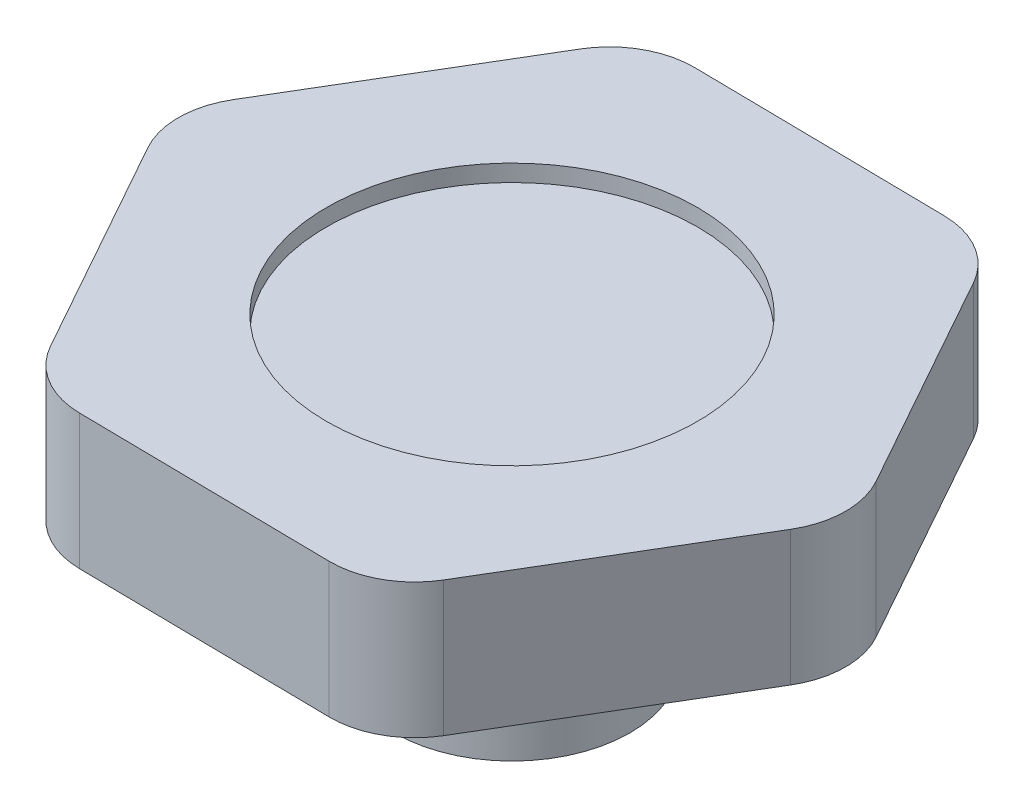
ISO-10303-21;
HEADER;
FILE_DESCRIPTION(('STEP AP214'),'2;1');
FILE_NAME('part.step','',(''),(''),'','','');
FILE_SCHEMA(('AUTOMOTIVE_DESIGN { 1 0 10303 214 1 1 1 1 }'));
ENDSEC;
DATA;
#1=APPLICATION_CONTEXT('core data for automotive mechanical design processes');
#2=APPLICATION_PROTOCOL_DEFINITION('international standard','automotive_design',2000,#1);
#3=PRODUCT_CONTEXT('',#1,'mechanical');
#4=PRODUCT('Part','Part','',(#3));
#5=PRODUCT_RELATED_PRODUCT_CATEGORY('part','',(#4));
#6=PRODUCT_DEFINITION_FORMATION('','',#4);
#7=PRODUCT_DEFINITION_CONTEXT('part definition',#1,'design');
#8=PRODUCT_DEFINITION('design','',#6,#7);
#9=PRODUCT_DEFINITION_SHAPE('','',#8);
#10=(LENGTH_UNIT() NAMED_UNIT(*) SI_UNIT(.MILLI.,.METRE.));
#11=(NAMED_UNIT(*) PLANE_ANGLE_UNIT() SI_UNIT($,.RADIAN.));
#12=(NAMED_UNIT(*) SI_UNIT($,.STERADIAN.) SOLID_ANGLE_UNIT());
#13=UNCERTAINTY_MEASURE_WITH_UNIT(LENGTH_MEASURE(1.E-05),#10,'distance_accuracy_value','');
#14=(GEOMETRIC_REPRESENTATION_CONTEXT(3) GLOBAL_UNCERTAINTY_ASSIGNED_CONTEXT((#13)) GLOBAL_UNIT_ASSIGNED_CONTEXT((#10,
#11,#12)) REPRESENTATION_CONTEXT('',''));
#15=CARTESIAN_POINT('',(0.,0.,0.));
#16=DIRECTION('',(0.,0.,1.));
#17=DIRECTION('',(1.,0.,0.));
#18=AXIS2_PLACEMENT_3D('',#15,#16,#17);
#19=CARTESIAN_POINT('',(0.,10.,0.));
#20=DIRECTION('',(0.,-1.,0.));
#21=DIRECTION('',(0.,0.,-1.));
#22=AXIS2_PLACEMENT_3D('',#19,#20,#21);
#23=CYLINDRICAL_SURFACE('',#22,7.);
#24=CARTESIAN_POINT('',(0.,10.,0.));
#25=DIRECTION('',(0.,1.,0.));
#26=DIRECTION('',(0.,0.,1.));
#27=AXIS2_PLACEMENT_3D('',#24,#25,#26);
#28=CIRCLE('',#27,7.);
#29=CARTESIAN_POINT('',(0.,10.,7.));
#30=VERTEX_POINT('',#29);
#31=EDGE_CURVE('E227',#30,#30,#28,.T.);
#32=ORIENTED_EDGE('',*,*,#31,.F.);
#33=EDGE_LOOP('',(#32));
#34=FACE_BOUND('',#33,.T.);
#35=CARTESIAN_POINT('',(0.,0.,0.));
#36=DIRECTION('',(0.,1.,0.));
#37=DIRECTION('',(0.,0.,1.));
#38=AXIS2_PLACEMENT_3D('',#35,#36,#37);
#39=CIRCLE('',#38,7.);
#40=CARTESIAN_POINT('',(0.,0.,7.));
#41=VERTEX_POINT('',#40);
#42=EDGE_CURVE('E219',#41,#41,#39,.T.);
#43=ORIENTED_EDGE('',*,*,#42,.T.);
#44=EDGE_LOOP('',(#43));
#45=FACE_BOUND('',#44,.T.);
#46=ADVANCED_FACE('F39',(#34,#45),#23,.T.);
#47=CARTESIAN_POINT('',(0.,0.,0.));
#48=DIRECTION('',(0.,1.,0.));
#49=DIRECTION('',(0.,0.,1.));
#50=AXIS2_PLACEMENT_3D('',#47,#48,#49);
#51=PLANE('',#50);
#52=DIRECTION('',(-0.00508635289667691,0.,0.999987064423441));
#53=VECTOR('',#52,1.);
#54=CARTESIAN_POINT('',(4.76388744027827,0.,-2.71821812768812));
#55=LINE('',#54,#53);
#56=CARTESIAN_POINT('',(4.76388744027827,0.,-2.71821812768812));
#57=VERTEX_POINT('',#56);
#58=CARTESIAN_POINT('',(4.73598967174442,0.,2.76653848020655));
#59=VERTEX_POINT('',#58);
#60=EDGE_CURVE('E210',#57,#59,#55,.T.);
#61=ORIENTED_EDGE('',*,*,#60,.F.);
#62=DIRECTION('',(0.863471024798187,0.,0.504398443032855));
#63=VECTOR('',#62,1.);
#64=CARTESIAN_POINT('',(0.0278977685338532,0.,-5.48475660789466));
#65=LINE('',#64,#63);
#66=CARTESIAN_POINT('',(0.0278977685338532,0.,-5.48475660789466));
#67=VERTEX_POINT('',#66);
#68=EDGE_CURVE('E175',#67,#57,#65,.T.);
#69=ORIENTED_EDGE('',*,*,#68,.F.);
#70=DIRECTION('',(0.868557377694864,0.,-0.495588621390586));
#71=VECTOR('',#70,1.);
#72=CARTESIAN_POINT('',(-4.73598967174442,0.,-2.76653848020655));
#73=LINE('',#72,#71);
#74=CARTESIAN_POINT('',(-4.73598967174442,0.,-2.76653848020655));
#75=VERTEX_POINT('',#74);
#76=EDGE_CURVE('E189',#75,#67,#73,.T.);
#77=ORIENTED_EDGE('',*,*,#76,.F.);
#78=DIRECTION('',(0.00508635289667691,0.,-0.999987064423441));
#79=VECTOR('',#78,1.);
#80=CARTESIAN_POINT('',(-4.76388744027827,0.,2.71821812768812));
#81=LINE('',#80,#79);
#82=CARTESIAN_POINT('',(-4.76388744027827,0.,2.71821812768812));
#83=VERTEX_POINT('',#82);
#84=EDGE_CURVE('E194',#83,#75,#81,.T.);
#85=ORIENTED_EDGE('',*,*,#84,.F.);
#86=DIRECTION('',(-0.863471024798187,0.,-0.504398443032855));
#87=VECTOR('',#86,1.);
#88=CARTESIAN_POINT('',(-0.0278977685338532,0.,5.48475660789466));
#89=LINE('',#88,#87);
#90=CARTESIAN_POINT('',(-0.0278977685338532,0.,5.48475660789466));
#91=VERTEX_POINT('',#90);
#92=EDGE_CURVE('E213',#91,#83,#89,.T.);
#93=ORIENTED_EDGE('',*,*,#92,.F.);
#94=DIRECTION('',(-0.868557377694864,0.,0.495588621390586));
#95=VECTOR('',#94,1.);
#96=CARTESIAN_POINT('',(4.73598967174442,0.,2.76653848020655));
#97=LINE('',#96,#95);
#98=EDGE_CURVE('E209',#59,#91,#97,.T.);
#99=ORIENTED_EDGE('',*,*,#98,.F.);
#100=EDGE_LOOP('',(#61,#69,#77,#85,#93,#99));
#101=FACE_BOUND('',#100,.T.);
#102=ORIENTED_EDGE('',*,*,#42,.F.);
#103=EDGE_LOOP('',(#102));
#104=FACE_BOUND('',#103,.T.);
#105=ADVANCED_FACE('F355',(#101,#104),#51,.F.);
#106=CARTESIAN_POINT('',(0.0278977685338532,5.,-5.48475660789466));
#107=DIRECTION('',(0.504398443032855,0.,-0.863471024798187));
#108=DIRECTION('',(-0.863471024798187,0.,-0.504398443032855));
#109=AXIS2_PLACEMENT_3D('',#106,#107,#108);
#110=PLANE('',#109);
#111=ORIENTED_EDGE('',*,*,#68,.T.);
#112=DIRECTION('',(0.,-1.,0.));
#113=VECTOR('',#112,1.);
#114=CARTESIAN_POINT('',(4.76388744027827,5.,-2.71821812768812));
#115=LINE('',#114,#113);
#116=CARTESIAN_POINT('',(4.76388744027827,5.,-2.71821812768812));
#117=VERTEX_POINT('',#116);
#118=EDGE_CURVE('E164',#117,#57,#115,.T.);
#119=ORIENTED_EDGE('',*,*,#118,.F.);
#120=DIRECTION('',(0.863471024798187,0.,0.504398443032855));
#121=VECTOR('',#120,1.);
#122=CARTESIAN_POINT('',(0.0278977685338532,5.,-5.48475660789466));
#123=LINE('',#122,#121);
#124=CARTESIAN_POINT('',(0.0278977685338532,5.,-5.48475660789466));
#125=VERTEX_POINT('',#124);
#126=EDGE_CURVE('E166',#125,#117,#123,.T.);
#127=ORIENTED_EDGE('',*,*,#126,.F.);
#128=DIRECTION('',(0.,-1.,0.));
#129=VECTOR('',#128,1.);
#130=CARTESIAN_POINT('',(0.0278977685338532,5.,-5.48475660789466));
#131=LINE('',#130,#129);
#132=EDGE_CURVE('E217',#125,#67,#131,.T.);
#133=ORIENTED_EDGE('',*,*,#132,.T.);
#134=EDGE_LOOP('',(#111,#119,#127,#133));
#135=FACE_BOUND('',#134,.T.);
#136=ADVANCED_FACE('F170',(#135),#110,.F.);
#137=CARTESIAN_POINT('',(-4.73598967174442,5.,-2.76653848020655));
#138=DIRECTION('',(-0.495588621390586,0.,-0.868557377694864));
#139=DIRECTION('',(-0.868557377694864,0.,0.495588621390586));
#140=AXIS2_PLACEMENT_3D('',#137,#138,#139);
#141=PLANE('',#140);
#142=ORIENTED_EDGE('',*,*,#76,.T.);
#143=ORIENTED_EDGE('',*,*,#132,.F.);
#144=DIRECTION('',(0.868557377694864,0.,-0.495588621390586));
#145=VECTOR('',#144,1.);
#146=CARTESIAN_POINT('',(-4.73598967174442,5.,-2.76653848020655));
#147=LINE('',#146,#145);
#148=CARTESIAN_POINT('',(-4.73598967174442,5.,-2.76653848020655));
#149=VERTEX_POINT('',#148);
#150=EDGE_CURVE('E177',#149,#125,#147,.T.);
#151=ORIENTED_EDGE('',*,*,#150,.F.);
#152=DIRECTION('',(0.,-1.,0.));
#153=VECTOR('',#152,1.);
#154=CARTESIAN_POINT('',(-4.73598967174442,5.,-2.76653848020655));
#155=LINE('',#154,#153);
#156=EDGE_CURVE('E222',#149,#75,#155,.T.);
#157=ORIENTED_EDGE('',*,*,#156,.T.);
#158=EDGE_LOOP('',(#142,#143,#151,#157));
#159=FACE_BOUND('',#158,.T.);
#160=ADVANCED_FACE('F415',(#159),#141,.F.);
#161=CARTESIAN_POINT('',(-4.76388744027827,5.,2.71821812768812));
#162=DIRECTION('',(-0.999987064423441,0.,-0.00508635289667691));
#163=DIRECTION('',(-0.00508635289667691,0.,0.999987064423441));
#164=AXIS2_PLACEMENT_3D('',#161,#162,#163);
#165=PLANE('',#164);
#166=ORIENTED_EDGE('',*,*,#84,.T.);
#167=ORIENTED_EDGE('',*,*,#156,.F.);
#168=DIRECTION('',(0.00508635289667691,0.,-0.999987064423441));
#169=VECTOR('',#168,1.);
#170=CARTESIAN_POINT('',(-4.76388744027827,5.,2.71821812768812));
#171=LINE('',#170,#169);
#172=CARTESIAN_POINT('',(-4.76388744027827,5.,2.71821812768812));
#173=VERTEX_POINT('',#172);
#174=EDGE_CURVE('E201',#173,#149,#171,.T.);
#175=ORIENTED_EDGE('',*,*,#174,.F.);
#176=DIRECTION('',(0.,-1.,0.));
#177=VECTOR('',#176,1.);
#178=CARTESIAN_POINT('',(-4.76388744027827,5.,2.71821812768812));
#179=LINE('',#178,#177);
#180=EDGE_CURVE('E224',#173,#83,#179,.T.);
#181=ORIENTED_EDGE('',*,*,#180,.T.);
#182=EDGE_LOOP('',(#166,#167,#175,#181));
#183=FACE_BOUND('',#182,.T.);
#184=ADVANCED_FACE('F416',(#183),#165,.F.);
#185=CARTESIAN_POINT('',(-0.0278977685338532,5.,5.48475660789466));
#186=DIRECTION('',(-0.504398443032855,0.,0.863471024798187));
#187=DIRECTION('',(0.863471024798187,0.,0.504398443032855));
#188=AXIS2_PLACEMENT_3D('',#185,#186,#187);
#189=PLANE('',#188);
#190=ORIENTED_EDGE('',*,*,#92,.T.);
#191=ORIENTED_EDGE('',*,*,#180,.F.);
#192=DIRECTION('',(-0.863471024798187,0.,-0.504398443032855));
#193=VECTOR('',#192,1.);
#194=CARTESIAN_POINT('',(-0.0278977685338532,5.,5.48475660789466));
#195=LINE('',#194,#193);
#196=CARTESIAN_POINT('',(-0.0278977685338532,5.,5.48475660789466));
#197=VERTEX_POINT('',#196);
#198=EDGE_CURVE('E199',#197,#173,#195,.T.);
#199=ORIENTED_EDGE('',*,*,#198,.F.);
#200=DIRECTION('',(0.,-1.,0.));
#201=VECTOR('',#200,1.);
#202=CARTESIAN_POINT('',(-0.0278977685338532,5.,5.48475660789466));
#203=LINE('',#202,#201);
#204=EDGE_CURVE('E223',#197,#91,#203,.T.);
#205=ORIENTED_EDGE('',*,*,#204,.T.);
#206=EDGE_LOOP('',(#190,#191,#199,#205));
#207=FACE_BOUND('',#206,.T.);
#208=ADVANCED_FACE('F425',(#207),#189,.F.);
#209=CARTESIAN_POINT('',(4.73598967174442,5.,2.76653848020655));
#210=DIRECTION('',(0.495588621390586,0.,0.868557377694864));
#211=DIRECTION('',(0.868557377694864,0.,-0.495588621390586));
#212=AXIS2_PLACEMENT_3D('',#209,#210,#211);
#213=PLANE('',#212);
#214=ORIENTED_EDGE('',*,*,#98,.T.);
#215=ORIENTED_EDGE('',*,*,#204,.F.);
#216=DIRECTION('',(-0.868557377694864,0.,0.495588621390586));
#217=VECTOR('',#216,1.);
#218=CARTESIAN_POINT('',(4.73598967174442,5.,2.76653848020655));
#219=LINE('',#218,#217);
#220=CARTESIAN_POINT('',(4.73598967174442,5.,2.76653848020655));
#221=VERTEX_POINT('',#220);
#222=EDGE_CURVE('E183',#221,#197,#219,.T.);
#223=ORIENTED_EDGE('',*,*,#222,.F.);
#224=DIRECTION('',(0.,-1.,0.));
#225=VECTOR('',#224,1.);
#226=CARTESIAN_POINT('',(4.73598967174442,5.,2.76653848020655));
#227=LINE('',#226,#225);
#228=EDGE_CURVE('E176',#221,#59,#227,.T.);
#229=ORIENTED_EDGE('',*,*,#228,.T.);
#230=EDGE_LOOP('',(#214,#215,#223,#229));
#231=FACE_BOUND('',#230,.T.);
#232=ADVANCED_FACE('F426',(#231),#213,.F.);
#233=CARTESIAN_POINT('',(4.76388744027827,5.,-2.71821812768812));
#234=DIRECTION('',(0.999987064423441,0.,0.00508635289667691));
#235=DIRECTION('',(0.00508635289667691,0.,-0.999987064423441));
#236=AXIS2_PLACEMENT_3D('',#233,#234,#235);
#237=PLANE('',#236);
#238=ORIENTED_EDGE('',*,*,#60,.T.);
#239=ORIENTED_EDGE('',*,*,#228,.F.);
#240=DIRECTION('',(-0.00508635289667691,0.,0.999987064423441));
#241=VECTOR('',#240,1.);
#242=CARTESIAN_POINT('',(4.76388744027827,5.,-2.71821812768812));
#243=LINE('',#242,#241);
#244=EDGE_CURVE('E180',#117,#221,#243,.T.);
#245=ORIENTED_EDGE('',*,*,#244,.F.);
#246=ORIENTED_EDGE('',*,*,#118,.T.);
#247=EDGE_LOOP('',(#238,#239,#245,#246));
#248=FACE_BOUND('',#247,.T.);
#249=ADVANCED_FACE('F182',(#248),#237,.F.);
#250=CARTESIAN_POINT('',(0.,5.,0.));
#251=DIRECTION('',(0.,-1.,0.));
#252=DIRECTION('',(0.,0.,-1.));
#253=AXIS2_PLACEMENT_3D('',#250,#251,#252);
#254=PLANE('',#253);
#255=ORIENTED_EDGE('',*,*,#126,.T.);
#256=ORIENTED_EDGE('',*,*,#244,.T.);
#257=ORIENTED_EDGE('',*,*,#222,.T.);
#258=ORIENTED_EDGE('',*,*,#198,.T.);
#259=ORIENTED_EDGE('',*,*,#174,.T.);
#260=ORIENTED_EDGE('',*,*,#150,.T.);
#261=EDGE_LOOP('',(#255,#256,#257,#258,#259,#260));
#262=FACE_BOUND('',#261,.T.);
#263=ADVANCED_FACE('F190',(#262),#254,.T.);
#264=CARTESIAN_POINT('',(10.1357882841343,18.,18.1456825680162));
#265=DIRECTION('',(-0.858841791641997,0.,-0.512240936405092));
#266=DIRECTION('',(-0.512240936405092,0.,0.858841791641997));
#267=AXIS2_PLACEMENT_3D('',#264,#265,#266);
#268=PLANE('',#267);
#269=DIRECTION('',(0.512240936405091,0.,-0.858841791641997));
#270=VECTOR('',#269,1.);
#271=CARTESIAN_POINT('',(10.1357882841343,10.,18.1456825680162));
#272=LINE('',#271,#270);
#273=CARTESIAN_POINT('',(11.6145004967514,10.,15.6664198700371));
#274=VERTEX_POINT('',#273);
#275=CARTESIAN_POINT('',(19.3038040023605,10.,2.77425384054615));
#276=VERTEX_POINT('',#275);
#277=EDGE_CURVE('E286',#274,#276,#272,.T.);
#278=ORIENTED_EDGE('',*,*,#277,.T.);
#279=DIRECTION('',(0.,-1.,0.));
#280=VECTOR('',#279,1.);
#281=CARTESIAN_POINT('',(19.3038040023605,18.,2.77425384054615));
#282=LINE('',#281,#280);
#283=CARTESIAN_POINT('',(19.3038040023605,18.,2.77425384054615));
#284=VERTEX_POINT('',#283);
#285=EDGE_CURVE('E11',#276,#284,#282,.F.);
#286=ORIENTED_EDGE('',*,*,#285,.T.);
#287=DIRECTION('',(0.512240936405091,0.,-0.858841791641997));
#288=VECTOR('',#287,1.);
#289=CARTESIAN_POINT('',(10.1357882841343,18.,18.1456825680162));
#290=LINE('',#289,#288);
#291=CARTESIAN_POINT('',(11.6145004967514,18.,15.6664198700371));
#292=VERTEX_POINT('',#291);
#293=EDGE_CURVE('E288',#292,#284,#290,.T.);
#294=ORIENTED_EDGE('',*,*,#293,.F.);
#295=DIRECTION('',(0.,-1.,0.));
#296=VECTOR('',#295,1.);
#297=CARTESIAN_POINT('',(11.6145004967514,18.,15.6664198700371));
#298=LINE('',#297,#296);
#299=EDGE_CURVE('E50',#292,#274,#298,.T.);
#300=ORIENTED_EDGE('',*,*,#299,.T.);
#301=EDGE_LOOP('',(#278,#286,#294,#300));
#302=FACE_BOUND('',#301,.T.);
#303=ADVANCED_FACE('F284',(#302),#268,.F.);
#304=CARTESIAN_POINT('',(20.7825162149776,18.,0.294991142567117));
#305=DIRECTION('',(-0.873034559606137,0.,0.487658341191165));
#306=DIRECTION('',(0.487658341191165,0.,0.873034559606137));
#307=AXIS2_PLACEMENT_3D('',#304,#305,#306);
#308=PLANE('',#307);
#309=DIRECTION('',(-0.487658341191165,0.,-0.873034559606137));
#310=VECTOR('',#309,1.);
#311=CARTESIAN_POINT('',(20.7825162149776,10.,0.294991142567117));
#312=LINE('',#311,#310);
#313=CARTESIAN_POINT('',(19.3747678421812,10.,-2.22524254743513));
#314=VERTEX_POINT('',#313);
#315=CARTESIAN_POINT('',(12.0544763036397,10.,-15.3304577354468));
#316=VERTEX_POINT('',#315);
#317=EDGE_CURVE('E300',#314,#316,#312,.T.);
#318=ORIENTED_EDGE('',*,*,#317,.T.);
#319=DIRECTION('',(0.,-1.,0.));
#320=VECTOR('',#319,1.);
#321=CARTESIAN_POINT('',(12.0544763036397,18.,-15.3304577354468));
#322=LINE('',#321,#320);
#323=CARTESIAN_POINT('',(12.0544763036397,18.,-15.3304577354468));
#324=VERTEX_POINT('',#323);
#325=EDGE_CURVE('E279',#316,#324,#322,.F.);
#326=ORIENTED_EDGE('',*,*,#325,.T.);
#327=DIRECTION('',(-0.487658341191165,0.,-0.873034559606137));
#328=VECTOR('',#327,1.);
#329=CARTESIAN_POINT('',(20.7825162149776,18.,0.294991142567117));
#330=LINE('',#329,#328);
#331=CARTESIAN_POINT('',(19.3747678421812,18.,-2.22524254743513));
#332=VERTEX_POINT('',#331);
#333=EDGE_CURVE('E317',#332,#324,#330,.T.);
#334=ORIENTED_EDGE('',*,*,#333,.F.);
#335=DIRECTION('',(0.,-1.,0.));
#336=VECTOR('',#335,1.);
#337=CARTESIAN_POINT('',(19.3747678421812,18.,-2.22524254743513));
#338=LINE('',#337,#336);
#339=EDGE_CURVE('E274',#332,#314,#338,.T.);
#340=ORIENTED_EDGE('',*,*,#339,.T.);
#341=EDGE_LOOP('',(#318,#326,#334,#340));
#342=FACE_BOUND('',#341,.T.);
#343=ADVANCED_FACE('F388',(#342),#308,.F.);
#344=CARTESIAN_POINT('',(10.6467279308433,18.,-17.8506914254491));
#345=DIRECTION('',(-0.0141927679641401,0.,0.999899277596257));
#346=DIRECTION('',(0.999899277596257,0.,0.0141927679641401));
#347=AXIS2_PLACEMENT_3D('',#344,#345,#346);
#348=PLANE('',#347);
#349=DIRECTION('',(-0.999899277596257,0.,-0.0141927679641401));
#350=VECTOR('',#349,1.);
#351=CARTESIAN_POINT('',(10.6467279308433,10.,-17.8506914254491));
#352=LINE('',#351,#350);
#353=CARTESIAN_POINT('',(7.76026734542977,10.,-17.8916624174723));
#354=VERTEX_POINT('',#353);
#355=CARTESIAN_POINT('',(-7.24932769872073,10.,-18.104711575993));
#356=VERTEX_POINT('',#355);
#357=EDGE_CURVE('E301',#354,#356,#352,.T.);
#358=ORIENTED_EDGE('',*,*,#357,.T.);
#359=DIRECTION('',(0.,-1.,0.));
#360=VECTOR('',#359,1.);
#361=CARTESIAN_POINT('',(-7.24932769872073,18.,-18.104711575993));
#362=LINE('',#361,#360);
#363=CARTESIAN_POINT('',(-7.24932769872073,18.,-18.104711575993));
#364=VERTEX_POINT('',#363);
#365=EDGE_CURVE('E272',#356,#364,#362,.F.);
#366=ORIENTED_EDGE('',*,*,#365,.T.);
#367=DIRECTION('',(-0.999899277596257,0.,-0.0141927679641401));
#368=VECTOR('',#367,1.);
#369=CARTESIAN_POINT('',(10.6467279308433,18.,-17.8506914254491));
#370=LINE('',#369,#368);
#371=CARTESIAN_POINT('',(7.76026734542977,18.,-17.8916624174723));
#372=VERTEX_POINT('',#371);
#373=EDGE_CURVE('E323',#372,#364,#370,.T.);
#374=ORIENTED_EDGE('',*,*,#373,.F.);
#375=DIRECTION('',(0.,-1.,0.));
#376=VECTOR('',#375,1.);
#377=CARTESIAN_POINT('',(7.76026734542977,18.,-17.8916624174723));
#378=LINE('',#377,#376);
#379=EDGE_CURVE('E269',#372,#354,#378,.T.);
#380=ORIENTED_EDGE('',*,*,#379,.T.);
#381=EDGE_LOOP('',(#358,#366,#374,#380));
#382=FACE_BOUND('',#381,.T.);
#383=ADVANCED_FACE('F394',(#382),#348,.F.);
#384=CARTESIAN_POINT('',(-10.1357882841343,18.,-18.1456825680162));
#385=DIRECTION('',(0.858841791641997,0.,0.512240936405092));
#386=DIRECTION('',(0.512240936405092,0.,-0.858841791641997));
#387=AXIS2_PLACEMENT_3D('',#384,#385,#386);
#388=PLANE('',#387);
#389=DIRECTION('',(-0.512240936405092,0.,0.858841791641997));
#390=VECTOR('',#389,1.);
#391=CARTESIAN_POINT('',(-10.1357882841343,10.,-18.1456825680162));
#392=LINE('',#391,#390);
#393=CARTESIAN_POINT('',(-11.6145004967514,10.,-15.6664198700371));
#394=VERTEX_POINT('',#393);
#395=CARTESIAN_POINT('',(-19.3038040023605,10.,-2.77425384054616));
#396=VERTEX_POINT('',#395);
#397=EDGE_CURVE('E313',#394,#396,#392,.T.);
#398=ORIENTED_EDGE('',*,*,#397,.T.);
#399=DIRECTION('',(0.,-1.,0.));
#400=VECTOR('',#399,1.);
#401=CARTESIAN_POINT('',(-19.3038040023605,18.,-2.77425384054616));
#402=LINE('',#401,#400);
#403=CARTESIAN_POINT('',(-19.3038040023605,18.,-2.77425384054616));
#404=VERTEX_POINT('',#403);
#405=EDGE_CURVE('E53',#396,#404,#402,.F.);
#406=ORIENTED_EDGE('',*,*,#405,.T.);
#407=DIRECTION('',(-0.512240936405092,0.,0.858841791641997));
#408=VECTOR('',#407,1.);
#409=CARTESIAN_POINT('',(-10.1357882841343,18.,-18.1456825680162));
#410=LINE('',#409,#408);
#411=CARTESIAN_POINT('',(-11.6145004967514,18.,-15.6664198700371));
#412=VERTEX_POINT('',#411);
#413=EDGE_CURVE('E327',#412,#404,#410,.T.);
#414=ORIENTED_EDGE('',*,*,#413,.F.);
#415=DIRECTION('',(0.,-1.,0.));
#416=VECTOR('',#415,1.);
#417=CARTESIAN_POINT('',(-11.6145004967514,18.,-15.6664198700371));
#418=LINE('',#417,#416);
#419=EDGE_CURVE('E266',#412,#394,#418,.T.);
#420=ORIENTED_EDGE('',*,*,#419,.T.);
#421=EDGE_LOOP('',(#398,#406,#414,#420));
#422=FACE_BOUND('',#421,.T.);
#423=ADVANCED_FACE('F346',(#422),#388,.F.);
#424=CARTESIAN_POINT('',(-20.7825162149776,18.,-0.294991142567123));
#425=DIRECTION('',(0.873034559606137,0.,-0.487658341191165));
#426=DIRECTION('',(-0.487658341191165,0.,-0.873034559606137));
#427=AXIS2_PLACEMENT_3D('',#424,#425,#426);
#428=PLANE('',#427);
#429=DIRECTION('',(0.487658341191165,0.,0.873034559606137));
#430=VECTOR('',#429,1.);
#431=CARTESIAN_POINT('',(-20.7825162149776,10.,-0.294991142567123));
#432=LINE('',#431,#430);
#433=CARTESIAN_POINT('',(-19.3747678421812,10.,2.22524254743512));
#434=VERTEX_POINT('',#433);
#435=CARTESIAN_POINT('',(-12.0544763036398,10.,15.3304577354468));
#436=VERTEX_POINT('',#435);
#437=EDGE_CURVE('E315',#434,#436,#432,.T.);
#438=ORIENTED_EDGE('',*,*,#437,.T.);
#439=DIRECTION('',(0.,-1.,0.));
#440=VECTOR('',#439,1.);
#441=CARTESIAN_POINT('',(-12.0544763036397,18.,15.3304577354468));
#442=LINE('',#441,#440);
#443=CARTESIAN_POINT('',(-12.0544763036398,18.,15.3304577354468));
#444=VERTEX_POINT('',#443);
#445=EDGE_CURVE('E251',#436,#444,#442,.F.);
#446=ORIENTED_EDGE('',*,*,#445,.T.);
#447=DIRECTION('',(0.487658341191165,0.,0.873034559606137));
#448=VECTOR('',#447,1.);
#449=CARTESIAN_POINT('',(-20.7825162149776,18.,-0.294991142567123));
#450=LINE('',#449,#448);
#451=CARTESIAN_POINT('',(-19.3747678421812,18.,2.22524254743512));
#452=VERTEX_POINT('',#451);
#453=EDGE_CURVE('E328',#452,#444,#450,.T.);
#454=ORIENTED_EDGE('',*,*,#453,.F.);
#455=DIRECTION('',(0.,-1.,0.));
#456=VECTOR('',#455,1.);
#457=CARTESIAN_POINT('',(-19.3747678421812,18.,2.22524254743512));
#458=LINE('',#457,#456);
#459=EDGE_CURVE('E250',#452,#434,#458,.T.);
#460=ORIENTED_EDGE('',*,*,#459,.T.);
#461=EDGE_LOOP('',(#438,#446,#454,#460));
#462=FACE_BOUND('',#461,.T.);
#463=ADVANCED_FACE('F338',(#462),#428,.F.);
#464=CARTESIAN_POINT('',(-10.6467279308433,18.,17.8506914254491));
#465=DIRECTION('',(0.0141927679641401,0.,-0.999899277596257));
#466=DIRECTION('',(-0.999899277596257,0.,-0.0141927679641401));
#467=AXIS2_PLACEMENT_3D('',#464,#465,#466);
#468=PLANE('',#467);
#469=DIRECTION('',(0.999899277596257,0.,0.0141927679641401));
#470=VECTOR('',#469,1.);
#471=CARTESIAN_POINT('',(-10.6467279308433,18.,17.8506914254491));
#472=LINE('',#471,#470);
#473=CARTESIAN_POINT('',(-7.76026734542977,18.,17.8916624174723));
#474=VERTEX_POINT('',#473);
#475=CARTESIAN_POINT('',(7.24932769872072,18.,18.104711575993));
#476=VERTEX_POINT('',#475);
#477=EDGE_CURVE('E208',#474,#476,#472,.T.);
#478=ORIENTED_EDGE('',*,*,#477,.F.);
#479=DIRECTION('',(0.,-1.,0.));
#480=VECTOR('',#479,1.);
#481=CARTESIAN_POINT('',(-7.76026734542977,18.,17.8916624174723));
#482=LINE('',#481,#480);
#483=CARTESIAN_POINT('',(-7.76026734542977,10.,17.8916624174723));
#484=VERTEX_POINT('',#483);
#485=EDGE_CURVE('E235',#474,#484,#482,.T.);
#486=ORIENTED_EDGE('',*,*,#485,.T.);
#487=DIRECTION('',(0.999899277596257,0.,0.0141927679641401));
#488=VECTOR('',#487,1.);
#489=CARTESIAN_POINT('',(-10.6467279308433,10.,17.8506914254491));
#490=LINE('',#489,#488);
#491=CARTESIAN_POINT('',(7.24932769872072,10.,18.104711575993));
#492=VERTEX_POINT('',#491);
#493=EDGE_CURVE('E198',#484,#492,#490,.T.);
#494=ORIENTED_EDGE('',*,*,#493,.T.);
#495=DIRECTION('',(0.,-1.,0.));
#496=VECTOR('',#495,1.);
#497=CARTESIAN_POINT('',(7.24932769872072,18.,18.104711575993));
#498=LINE('',#497,#496);
#499=EDGE_CURVE('E231',#492,#476,#498,.F.);
#500=ORIENTED_EDGE('',*,*,#499,.T.);
#501=EDGE_LOOP('',(#478,#486,#494,#500));
#502=FACE_BOUND('',#501,.T.);
#503=ADVANCED_FACE('F340',(#502),#468,.F.);
#504=CARTESIAN_POINT('',(0.,18.,0.));
#505=DIRECTION('',(0.,1.,0.));
#506=DIRECTION('',(0.,0.,1.));
#507=AXIS2_PLACEMENT_3D('',#504,#505,#506);
#508=PLANE('',#507);
#509=CARTESIAN_POINT('',(0.,18.,0.));
#510=DIRECTION('',(0.,1.,0.));
#511=DIRECTION('',(0.,0.,1.));
#512=AXIS2_PLACEMENT_3D('',#509,#510,#511);
#513=CIRCLE('',#512,11.);
#514=CARTESIAN_POINT('',(0.,18.,11.));
#515=VERTEX_POINT('',#514);
#516=EDGE_CURVE('E303',#515,#515,#513,.T.);
#517=ORIENTED_EDGE('',*,*,#516,.F.);
#518=EDGE_LOOP('',(#517));
#519=FACE_BOUND('',#518,.T.);
#520=ORIENTED_EDGE('',*,*,#453,.T.);
#521=CARTESIAN_POINT('',(-7.68930350560906,18.,12.892166029491));
#522=DIRECTION('',(0.,1.,0.));
#523=DIRECTION('',(0.,0.,1.));
#524=AXIS2_PLACEMENT_3D('',#521,#522,#523);
#525=CIRCLE('',#524,5.);
#526=EDGE_CURVE('E262',#444,#474,#525,.T.);
#527=ORIENTED_EDGE('',*,*,#526,.T.);
#528=ORIENTED_EDGE('',*,*,#477,.T.);
#529=CARTESIAN_POINT('',(7.32029153854142,18.,13.1052151880117));
#530=DIRECTION('',(0.,1.,0.));
#531=DIRECTION('',(0.,0.,1.));
#532=AXIS2_PLACEMENT_3D('',#529,#530,#531);
#533=CIRCLE('',#532,5.);
#534=EDGE_CURVE('E254',#476,#292,#533,.T.);
#535=ORIENTED_EDGE('',*,*,#534,.T.);
#536=ORIENTED_EDGE('',*,*,#293,.T.);
#537=CARTESIAN_POINT('',(15.0095950441505,18.,0.213049158520696));
#538=DIRECTION('',(0.,1.,0.));
#539=DIRECTION('',(0.,0.,1.));
#540=AXIS2_PLACEMENT_3D('',#537,#538,#539);
#541=CIRCLE('',#540,5.);
#542=EDGE_CURVE('E260',#284,#332,#541,.T.);
#543=ORIENTED_EDGE('',*,*,#542,.T.);
#544=ORIENTED_EDGE('',*,*,#333,.T.);
#545=CARTESIAN_POINT('',(7.68930350560906,18.,-12.892166029491));
#546=DIRECTION('',(0.,1.,0.));
#547=DIRECTION('',(0.,0.,1.));
#548=AXIS2_PLACEMENT_3D('',#545,#546,#547);
#549=CIRCLE('',#548,5.);
#550=EDGE_CURVE('E259',#324,#372,#549,.T.);
#551=ORIENTED_EDGE('',*,*,#550,.T.);
#552=ORIENTED_EDGE('',*,*,#373,.T.);
#553=CARTESIAN_POINT('',(-7.32029153854143,18.,-13.1052151880117));
#554=DIRECTION('',(0.,1.,0.));
#555=DIRECTION('',(0.,0.,1.));
#556=AXIS2_PLACEMENT_3D('',#553,#554,#555);
#557=CIRCLE('',#556,5.);
#558=EDGE_CURVE('E61',#364,#412,#557,.T.);
#559=ORIENTED_EDGE('',*,*,#558,.T.);
#560=ORIENTED_EDGE('',*,*,#413,.T.);
#561=CARTESIAN_POINT('',(-15.0095950441505,18.,-0.213049158520703));
#562=DIRECTION('',(0.,1.,0.));
#563=DIRECTION('',(0.,0.,1.));
#564=AXIS2_PLACEMENT_3D('',#561,#562,#563);
#565=CIRCLE('',#564,5.);
#566=EDGE_CURVE('E265',#404,#452,#565,.T.);
#567=ORIENTED_EDGE('',*,*,#566,.T.);
#568=EDGE_LOOP('',(#520,#527,#528,#535,#536,#543,#544,#551,#552,#559,#560,#567));
#569=FACE_BOUND('',#568,.T.);
#570=ADVANCED_FACE('F333',(#519,#569),#508,.T.);
#571=CARTESIAN_POINT('',(0.,10.,0.));
#572=DIRECTION('',(0.,1.,0.));
#573=DIRECTION('',(0.,0.,1.));
#574=AXIS2_PLACEMENT_3D('',#571,#572,#573);
#575=PLANE('',#574);
#576=ORIENTED_EDGE('',*,*,#31,.T.);
#577=EDGE_LOOP('',(#576));
#578=FACE_BOUND('',#577,.T.);
#579=ORIENTED_EDGE('',*,*,#493,.F.);
#580=CARTESIAN_POINT('',(-7.68930350560906,10.,12.892166029491));
#581=DIRECTION('',(0.,1.,0.));
#582=DIRECTION('',(0.,0.,1.));
#583=AXIS2_PLACEMENT_3D('',#580,#581,#582);
#584=CIRCLE('',#583,5.);
#585=EDGE_CURVE('E249',#484,#436,#584,.F.);
#586=ORIENTED_EDGE('',*,*,#585,.T.);
#587=ORIENTED_EDGE('',*,*,#437,.F.);
#588=CARTESIAN_POINT('',(-15.0095950441505,10.,-0.213049158520703));
#589=DIRECTION('',(0.,1.,0.));
#590=DIRECTION('',(0.,0.,1.));
#591=AXIS2_PLACEMENT_3D('',#588,#589,#590);
#592=CIRCLE('',#591,5.);
#593=EDGE_CURVE('E246',#434,#396,#592,.F.);
#594=ORIENTED_EDGE('',*,*,#593,.T.);
#595=ORIENTED_EDGE('',*,*,#397,.F.);
#596=CARTESIAN_POINT('',(-7.32029153854143,10.,-13.1052151880117));
#597=DIRECTION('',(0.,1.,0.));
#598=DIRECTION('',(0.,0.,1.));
#599=AXIS2_PLACEMENT_3D('',#596,#597,#598);
#600=CIRCLE('',#599,5.);
#601=EDGE_CURVE('E243',#394,#356,#600,.F.);
#602=ORIENTED_EDGE('',*,*,#601,.T.);
#603=ORIENTED_EDGE('',*,*,#357,.F.);
#604=CARTESIAN_POINT('',(7.68930350560906,10.,-12.892166029491));
#605=DIRECTION('',(0.,1.,0.));
#606=DIRECTION('',(0.,0.,1.));
#607=AXIS2_PLACEMENT_3D('',#604,#605,#606);
#608=CIRCLE('',#607,5.);
#609=EDGE_CURVE('E245',#354,#316,#608,.F.);
#610=ORIENTED_EDGE('',*,*,#609,.T.);
#611=ORIENTED_EDGE('',*,*,#317,.F.);
#612=CARTESIAN_POINT('',(15.0095950441505,10.,0.213049158520696));
#613=DIRECTION('',(0.,1.,0.));
#614=DIRECTION('',(0.,0.,1.));
#615=AXIS2_PLACEMENT_3D('',#612,#613,#614);
#616=CIRCLE('',#615,5.);
#617=EDGE_CURVE('E238',#314,#276,#616,.F.);
#618=ORIENTED_EDGE('',*,*,#617,.T.);
#619=ORIENTED_EDGE('',*,*,#277,.F.);
#620=CARTESIAN_POINT('',(7.32029153854142,10.,13.1052151880117));
#621=DIRECTION('',(0.,1.,0.));
#622=DIRECTION('',(0.,0.,1.));
#623=AXIS2_PLACEMENT_3D('',#620,#621,#622);
#624=CIRCLE('',#623,5.);
#625=EDGE_CURVE('E236',#274,#492,#624,.F.);
#626=ORIENTED_EDGE('',*,*,#625,.T.);
#627=EDGE_LOOP('',(#579,#586,#587,#594,#595,#602,#603,#610,#611,#618,#619,#626));
#628=FACE_BOUND('',#627,.T.);
#629=ADVANCED_FACE('F294',(#578,#628),#575,.F.);
#630=CARTESIAN_POINT('',(-7.68930350560906,18.,12.892166029491));
#631=DIRECTION('',(0.,-1.,0.));
#632=DIRECTION('',(0.,0.,-1.));
#633=AXIS2_PLACEMENT_3D('',#630,#631,#632);
#634=CYLINDRICAL_SURFACE('',#633,5.);
#635=ORIENTED_EDGE('',*,*,#526,.F.);
#636=ORIENTED_EDGE('',*,*,#445,.F.);
#637=ORIENTED_EDGE('',*,*,#585,.F.);
#638=ORIENTED_EDGE('',*,*,#485,.F.);
#639=EDGE_LOOP('',(#635,#636,#637,#638));
#640=FACE_BOUND('',#639,.T.);
#641=ADVANCED_FACE('F365',(#640),#634,.T.);
#642=CARTESIAN_POINT('',(-15.0095950441505,18.,-0.213049158520703));
#643=DIRECTION('',(0.,-1.,0.));
#644=DIRECTION('',(0.,0.,-1.));
#645=AXIS2_PLACEMENT_3D('',#642,#643,#644);
#646=CYLINDRICAL_SURFACE('',#645,5.);
#647=ORIENTED_EDGE('',*,*,#566,.F.);
#648=ORIENTED_EDGE('',*,*,#405,.F.);
#649=ORIENTED_EDGE('',*,*,#593,.F.);
#650=ORIENTED_EDGE('',*,*,#459,.F.);
#651=EDGE_LOOP('',(#647,#648,#649,#650));
#652=FACE_BOUND('',#651,.T.);
#653=ADVANCED_FACE('F370',(#652),#646,.T.);
#654=CARTESIAN_POINT('',(-7.32029153854143,18.,-13.1052151880117));
#655=DIRECTION('',(0.,-1.,0.));
#656=DIRECTION('',(0.,0.,-1.));
#657=AXIS2_PLACEMENT_3D('',#654,#655,#656);
#658=CYLINDRICAL_SURFACE('',#657,5.);
#659=ORIENTED_EDGE('',*,*,#558,.F.);
#660=ORIENTED_EDGE('',*,*,#365,.F.);
#661=ORIENTED_EDGE('',*,*,#601,.F.);
#662=ORIENTED_EDGE('',*,*,#419,.F.);
#663=EDGE_LOOP('',(#659,#660,#661,#662));
#664=FACE_BOUND('',#663,.T.);
#665=ADVANCED_FACE('F371',(#664),#658,.T.);
#666=CARTESIAN_POINT('',(7.68930350560906,18.,-12.892166029491));
#667=DIRECTION('',(0.,-1.,0.));
#668=DIRECTION('',(0.,0.,-1.));
#669=AXIS2_PLACEMENT_3D('',#666,#667,#668);
#670=CYLINDRICAL_SURFACE('',#669,5.);
#671=ORIENTED_EDGE('',*,*,#550,.F.);
#672=ORIENTED_EDGE('',*,*,#325,.F.);
#673=ORIENTED_EDGE('',*,*,#609,.F.);
#674=ORIENTED_EDGE('',*,*,#379,.F.);
#675=EDGE_LOOP('',(#671,#672,#673,#674));
#676=FACE_BOUND('',#675,.T.);
#677=ADVANCED_FACE('F374',(#676),#670,.T.);
#678=CARTESIAN_POINT('',(15.0095950441505,18.,0.213049158520696));
#679=DIRECTION('',(0.,-1.,0.));
#680=DIRECTION('',(0.,0.,-1.));
#681=AXIS2_PLACEMENT_3D('',#678,#679,#680);
#682=CYLINDRICAL_SURFACE('',#681,5.);
#683=ORIENTED_EDGE('',*,*,#542,.F.);
#684=ORIENTED_EDGE('',*,*,#285,.F.);
#685=ORIENTED_EDGE('',*,*,#617,.F.);
#686=ORIENTED_EDGE('',*,*,#339,.F.);
#687=EDGE_LOOP('',(#683,#684,#685,#686));
#688=FACE_BOUND('',#687,.T.);
#689=ADVANCED_FACE('F378',(#688),#682,.T.);
#690=CARTESIAN_POINT('',(7.32029153854142,18.,13.1052151880117));
#691=DIRECTION('',(0.,-1.,0.));
#692=DIRECTION('',(0.,0.,-1.));
#693=AXIS2_PLACEMENT_3D('',#690,#691,#692);
#694=CYLINDRICAL_SURFACE('',#693,5.);
#695=ORIENTED_EDGE('',*,*,#534,.F.);
#696=ORIENTED_EDGE('',*,*,#499,.F.);
#697=ORIENTED_EDGE('',*,*,#625,.F.);
#698=ORIENTED_EDGE('',*,*,#299,.F.);
#699=EDGE_LOOP('',(#695,#696,#697,#698));
#700=FACE_BOUND('',#699,.T.);
#701=ADVANCED_FACE('F41',(#700),#694,.T.);
#702=CARTESIAN_POINT('',(0.,17.,0.));
#703=DIRECTION('',(0.,1.,0.));
#704=DIRECTION('',(0.,0.,1.));
#705=AXIS2_PLACEMENT_3D('',#702,#703,#704);
#706=CYLINDRICAL_SURFACE('',#705,11.);
#707=CARTESIAN_POINT('',(0.,17.,0.));
#708=DIRECTION('',(0.,1.,0.));
#709=DIRECTION('',(0.,0.,1.));
#710=AXIS2_PLACEMENT_3D('',#707,#708,#709);
#711=CIRCLE('',#710,11.);
#712=CARTESIAN_POINT('',(0.,17.,11.));
#713=VERTEX_POINT('',#712);
#714=EDGE_CURVE('E297',#713,#713,#711,.T.);
#715=ORIENTED_EDGE('',*,*,#714,.F.);
#716=EDGE_LOOP('',(#715));
#717=FACE_BOUND('',#716,.T.);
#718=ORIENTED_EDGE('',*,*,#516,.T.);
#719=EDGE_LOOP('',(#718));
#720=FACE_BOUND('',#719,.T.);
#721=ADVANCED_FACE('F384',(#717,#720),#706,.F.);
#722=CARTESIAN_POINT('',(0.,17.,0.));
#723=DIRECTION('',(0.,1.,0.));
#724=DIRECTION('',(0.,0.,1.));
#725=AXIS2_PLACEMENT_3D('',#722,#723,#724);
#726=PLANE('',#725);
#727=ORIENTED_EDGE('',*,*,#714,.T.);
#728=EDGE_LOOP('',(#727));
#729=FACE_BOUND('',#728,.T.);
#730=ADVANCED_FACE('F554',(#729),#726,.T.);
#731=CLOSED_SHELL('',(#46,#105,#136,#160,#184,#208,#232,#249,#263,#303,#343,#383,#423,#463,#503,
#570,#629,#641,#653,#665,#677,#689,#701,#721,#730));
#732=MANIFOLD_SOLID_BREP('B2',#731);
#733=ADVANCED_BREP_SHAPE_REPRESENTATION('',(#18,#732),#14);
#734=SHAPE_DEFINITION_REPRESENTATION(#9,#733);
ENDSEC;
END-ISO-10303-21;
